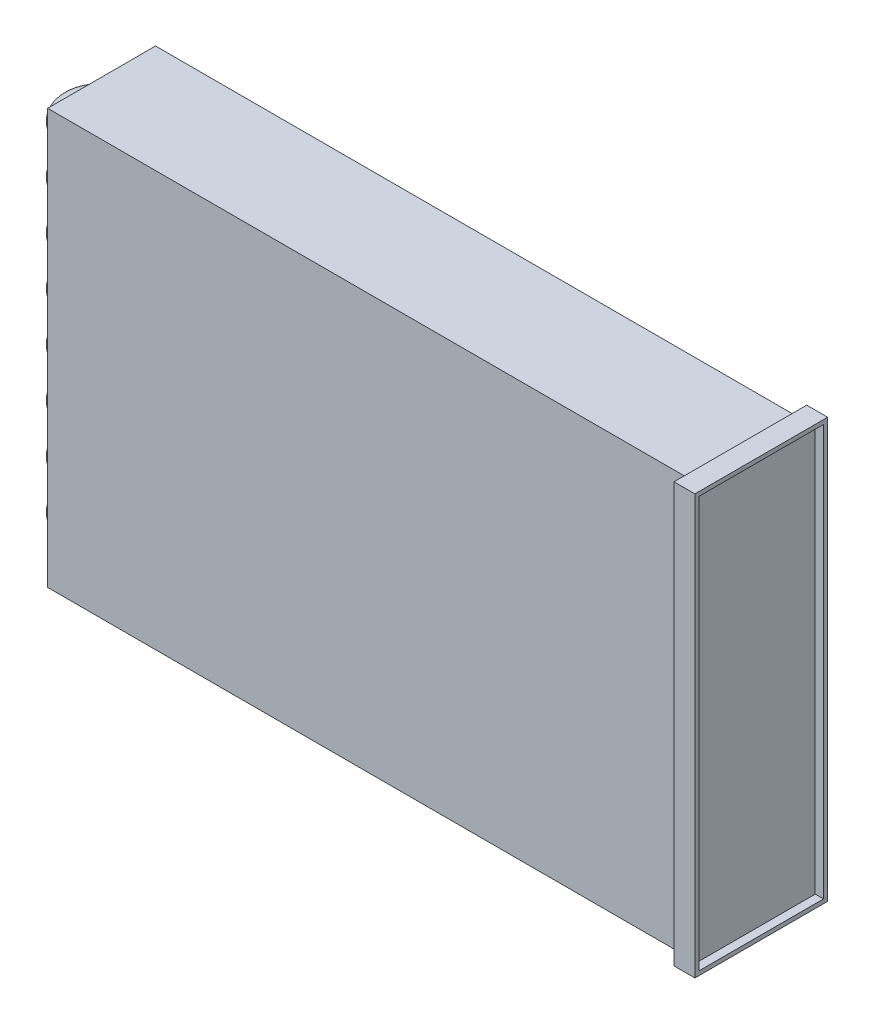
ISO-10303-21;
HEADER;
FILE_DESCRIPTION(('STEP AP214'),'2;1');
FILE_NAME('part.step','',(''),(''),'','','');
FILE_SCHEMA(('AUTOMOTIVE_DESIGN { 1 0 10303 214 1 1 1 1 }'));
ENDSEC;
DATA;
#1=APPLICATION_CONTEXT('core data for automotive mechanical design processes');
#2=APPLICATION_PROTOCOL_DEFINITION('international standard','automotive_design',2000,#1);
#3=PRODUCT_CONTEXT('',#1,'mechanical');
#4=PRODUCT('Part','Part','',(#3));
#5=PRODUCT_RELATED_PRODUCT_CATEGORY('part','',(#4));
#6=PRODUCT_DEFINITION_FORMATION('','',#4);
#7=PRODUCT_DEFINITION_CONTEXT('part definition',#1,'design');
#8=PRODUCT_DEFINITION('design','',#6,#7);
#9=PRODUCT_DEFINITION_SHAPE('','',#8);
#10=(LENGTH_UNIT() NAMED_UNIT(*) SI_UNIT(.MILLI.,.METRE.));
#11=(NAMED_UNIT(*) PLANE_ANGLE_UNIT() SI_UNIT($,.RADIAN.));
#12=(NAMED_UNIT(*) SI_UNIT($,.STERADIAN.) SOLID_ANGLE_UNIT());
#13=UNCERTAINTY_MEASURE_WITH_UNIT(LENGTH_MEASURE(1.E-05),#10,'distance_accuracy_value','');
#14=(GEOMETRIC_REPRESENTATION_CONTEXT(3) GLOBAL_UNCERTAINTY_ASSIGNED_CONTEXT((#13)) GLOBAL_UNIT_ASSIGNED_CONTEXT((#10,
#11,#12)) REPRESENTATION_CONTEXT('',''));
#15=CARTESIAN_POINT('',(0.,0.,0.));
#16=DIRECTION('',(0.,0.,1.));
#17=DIRECTION('',(1.,0.,0.));
#18=AXIS2_PLACEMENT_3D('',#15,#16,#17);
#19=CARTESIAN_POINT('',(-122.1875,-79.375,20.6375));
#20=DIRECTION('',(1.,0.,0.));
#21=DIRECTION('',(0.,0.,-1.));
#22=AXIS2_PLACEMENT_3D('',#19,#20,#21);
#23=PLANE('',#22);
#24=CARTESIAN_POINT('',(-122.1875,-64.575,-10.3125));
#25=DIRECTION('',(-1.,0.,0.));
#26=DIRECTION('',(0.,0.,1.));
#27=AXIS2_PLACEMENT_3D('',#24,#25,#26);
#28=CIRCLE('',#27,4.04999999999999);
#29=CARTESIAN_POINT('',(-122.1875,-64.575,-14.3625));
#30=VERTEX_POINT('',#29);
#31=EDGE_CURVE('E262',#30,#30,#28,.T.);
#32=ORIENTED_EDGE('',*,*,#31,.F.);
#33=EDGE_LOOP('',(#32));
#34=FACE_BOUND('',#33,.T.);
#35=CARTESIAN_POINT('',(-122.1875,-64.575,11.0375));
#36=DIRECTION('',(1.,0.,0.));
#37=DIRECTION('',(0.,0.,-1.));
#38=AXIS2_PLACEMENT_3D('',#35,#36,#37);
#39=CIRCLE('',#38,4.04999999999999);
#40=CARTESIAN_POINT('',(-122.1875,-64.575,15.0875));
#41=VERTEX_POINT('',#40);
#42=EDGE_CURVE('E266',#41,#41,#39,.T.);
#43=ORIENTED_EDGE('',*,*,#42,.T.);
#44=EDGE_LOOP('',(#43));
#45=FACE_BOUND('',#44,.T.);
#46=CARTESIAN_POINT('',(-122.1875,-46.075,-10.3125));
#47=DIRECTION('',(-1.,0.,0.));
#48=DIRECTION('',(0.,0.,1.));
#49=AXIS2_PLACEMENT_3D('',#46,#47,#48);
#50=CIRCLE('',#49,4.04999999999999);
#51=CARTESIAN_POINT('',(-122.1875,-46.075,-14.3625));
#52=VERTEX_POINT('',#51);
#53=EDGE_CURVE('E270',#52,#52,#50,.T.);
#54=ORIENTED_EDGE('',*,*,#53,.F.);
#55=EDGE_LOOP('',(#54));
#56=FACE_BOUND('',#55,.T.);
#57=CARTESIAN_POINT('',(-122.1875,-46.075,11.0375));
#58=DIRECTION('',(1.,0.,0.));
#59=DIRECTION('',(0.,0.,-1.));
#60=AXIS2_PLACEMENT_3D('',#57,#58,#59);
#61=CIRCLE('',#60,4.04999999999999);
#62=CARTESIAN_POINT('',(-122.1875,-46.075,15.0875));
#63=VERTEX_POINT('',#62);
#64=EDGE_CURVE('E274',#63,#63,#61,.T.);
#65=ORIENTED_EDGE('',*,*,#64,.T.);
#66=EDGE_LOOP('',(#65));
#67=FACE_BOUND('',#66,.T.);
#68=CARTESIAN_POINT('',(-122.1875,-27.575,-10.3125));
#69=DIRECTION('',(-1.,0.,0.));
#70=DIRECTION('',(0.,0.,1.));
#71=AXIS2_PLACEMENT_3D('',#68,#69,#70);
#72=CIRCLE('',#71,4.04999999999999);
#73=CARTESIAN_POINT('',(-122.1875,-27.575,-14.3625));
#74=VERTEX_POINT('',#73);
#75=EDGE_CURVE('E278',#74,#74,#72,.T.);
#76=ORIENTED_EDGE('',*,*,#75,.F.);
#77=EDGE_LOOP('',(#76));
#78=FACE_BOUND('',#77,.T.);
#79=CARTESIAN_POINT('',(-122.1875,-27.575,11.0375));
#80=DIRECTION('',(1.,0.,0.));
#81=DIRECTION('',(0.,0.,-1.));
#82=AXIS2_PLACEMENT_3D('',#79,#80,#81);
#83=CIRCLE('',#82,4.04999999999999);
#84=CARTESIAN_POINT('',(-122.1875,-27.575,15.0875));
#85=VERTEX_POINT('',#84);
#86=EDGE_CURVE('E282',#85,#85,#83,.T.);
#87=ORIENTED_EDGE('',*,*,#86,.T.);
#88=EDGE_LOOP('',(#87));
#89=FACE_BOUND('',#88,.T.);
#90=CARTESIAN_POINT('',(-122.1875,-9.075,-10.3125));
#91=DIRECTION('',(-1.,0.,0.));
#92=DIRECTION('',(0.,0.,1.));
#93=AXIS2_PLACEMENT_3D('',#90,#91,#92);
#94=CIRCLE('',#93,4.04999999999999);
#95=CARTESIAN_POINT('',(-122.1875,-9.075,-14.3625));
#96=VERTEX_POINT('',#95);
#97=EDGE_CURVE('E286',#96,#96,#94,.T.);
#98=ORIENTED_EDGE('',*,*,#97,.F.);
#99=EDGE_LOOP('',(#98));
#100=FACE_BOUND('',#99,.T.);
#101=CARTESIAN_POINT('',(-122.1875,-9.075,11.0375));
#102=DIRECTION('',(1.,0.,0.));
#103=DIRECTION('',(0.,0.,-1.));
#104=AXIS2_PLACEMENT_3D('',#101,#102,#103);
#105=CIRCLE('',#104,4.04999999999999);
#106=CARTESIAN_POINT('',(-122.1875,-9.075,15.0875));
#107=VERTEX_POINT('',#106);
#108=EDGE_CURVE('E290',#107,#107,#105,.T.);
#109=ORIENTED_EDGE('',*,*,#108,.T.);
#110=EDGE_LOOP('',(#109));
#111=FACE_BOUND('',#110,.T.);
#112=CARTESIAN_POINT('',(-122.1875,9.425,-10.3125));
#113=DIRECTION('',(-1.,0.,0.));
#114=DIRECTION('',(0.,0.,1.));
#115=AXIS2_PLACEMENT_3D('',#112,#113,#114);
#116=CIRCLE('',#115,4.04999999999999);
#117=CARTESIAN_POINT('',(-122.1875,9.425,-14.3625));
#118=VERTEX_POINT('',#117);
#119=EDGE_CURVE('E294',#118,#118,#116,.T.);
#120=ORIENTED_EDGE('',*,*,#119,.F.);
#121=EDGE_LOOP('',(#120));
#122=FACE_BOUND('',#121,.T.);
#123=CARTESIAN_POINT('',(-122.1875,9.425,11.0375));
#124=DIRECTION('',(1.,0.,0.));
#125=DIRECTION('',(0.,0.,-1.));
#126=AXIS2_PLACEMENT_3D('',#123,#124,#125);
#127=CIRCLE('',#126,4.04999999999999);
#128=CARTESIAN_POINT('',(-122.1875,9.425,15.0875));
#129=VERTEX_POINT('',#128);
#130=EDGE_CURVE('E298',#129,#129,#127,.T.);
#131=ORIENTED_EDGE('',*,*,#130,.T.);
#132=EDGE_LOOP('',(#131));
#133=FACE_BOUND('',#132,.T.);
#134=CARTESIAN_POINT('',(-122.1875,27.925,-10.3125));
#135=DIRECTION('',(-1.,0.,0.));
#136=DIRECTION('',(0.,0.,1.));
#137=AXIS2_PLACEMENT_3D('',#134,#135,#136);
#138=CIRCLE('',#137,4.04999999999999);
#139=CARTESIAN_POINT('',(-122.1875,27.925,-14.3625));
#140=VERTEX_POINT('',#139);
#141=EDGE_CURVE('E302',#140,#140,#138,.T.);
#142=ORIENTED_EDGE('',*,*,#141,.F.);
#143=EDGE_LOOP('',(#142));
#144=FACE_BOUND('',#143,.T.);
#145=CARTESIAN_POINT('',(-122.1875,27.925,11.0375));
#146=DIRECTION('',(1.,0.,0.));
#147=DIRECTION('',(0.,0.,-1.));
#148=AXIS2_PLACEMENT_3D('',#145,#146,#147);
#149=CIRCLE('',#148,4.04999999999999);
#150=CARTESIAN_POINT('',(-122.1875,27.925,15.0875));
#151=VERTEX_POINT('',#150);
#152=EDGE_CURVE('E306',#151,#151,#149,.T.);
#153=ORIENTED_EDGE('',*,*,#152,.T.);
#154=EDGE_LOOP('',(#153));
#155=FACE_BOUND('',#154,.T.);
#156=CARTESIAN_POINT('',(-122.1875,46.425,-10.3125));
#157=DIRECTION('',(-1.,0.,0.));
#158=DIRECTION('',(0.,0.,1.));
#159=AXIS2_PLACEMENT_3D('',#156,#157,#158);
#160=CIRCLE('',#159,4.04999999999999);
#161=CARTESIAN_POINT('',(-122.1875,46.425,-14.3625));
#162=VERTEX_POINT('',#161);
#163=EDGE_CURVE('E310',#162,#162,#160,.T.);
#164=ORIENTED_EDGE('',*,*,#163,.F.);
#165=EDGE_LOOP('',(#164));
#166=FACE_BOUND('',#165,.T.);
#167=CARTESIAN_POINT('',(-122.1875,46.425,11.0375));
#168=DIRECTION('',(1.,0.,0.));
#169=DIRECTION('',(0.,0.,-1.));
#170=AXIS2_PLACEMENT_3D('',#167,#168,#169);
#171=CIRCLE('',#170,4.04999999999999);
#172=CARTESIAN_POINT('',(-122.1875,46.425,15.0875));
#173=VERTEX_POINT('',#172);
#174=EDGE_CURVE('E162',#173,#173,#171,.T.);
#175=ORIENTED_EDGE('',*,*,#174,.T.);
#176=EDGE_LOOP('',(#175));
#177=FACE_BOUND('',#176,.T.);
#178=CARTESIAN_POINT('',(-122.1875,64.925,-10.3125));
#179=DIRECTION('',(-1.,0.,0.));
#180=DIRECTION('',(0.,0.,1.));
#181=AXIS2_PLACEMENT_3D('',#178,#179,#180);
#182=CIRCLE('',#181,4.04999999999999);
#183=CARTESIAN_POINT('',(-122.1875,64.925,-14.3625));
#184=VERTEX_POINT('',#183);
#185=EDGE_CURVE('E174',#184,#184,#182,.T.);
#186=ORIENTED_EDGE('',*,*,#185,.F.);
#187=EDGE_LOOP('',(#186));
#188=FACE_BOUND('',#187,.T.);
#189=CARTESIAN_POINT('',(-122.1875,64.925,11.0375));
#190=DIRECTION('',(1.,0.,0.));
#191=DIRECTION('',(0.,0.,-1.));
#192=AXIS2_PLACEMENT_3D('',#189,#190,#191);
#193=CIRCLE('',#192,4.04999999999999);
#194=CARTESIAN_POINT('',(-122.1875,64.925,15.0875));
#195=VERTEX_POINT('',#194);
#196=EDGE_CURVE('E180',#195,#195,#193,.T.);
#197=ORIENTED_EDGE('',*,*,#196,.T.);
#198=EDGE_LOOP('',(#197));
#199=FACE_BOUND('',#198,.T.);
#200=DIRECTION('',(0.,-1.,0.));
#201=VECTOR('',#200,1.);
#202=CARTESIAN_POINT('',(-122.1875,-79.375,-20.6375));
#203=LINE('',#202,#201);
#204=CARTESIAN_POINT('',(-122.1875,79.375,-20.6375));
#205=VERTEX_POINT('',#204);
#206=CARTESIAN_POINT('',(-122.1875,-79.375,-20.6375));
#207=VERTEX_POINT('',#206);
#208=EDGE_CURVE('E213',#205,#207,#203,.T.);
#209=ORIENTED_EDGE('',*,*,#208,.T.);
#210=DIRECTION('',(0.,0.,-1.));
#211=VECTOR('',#210,1.);
#212=CARTESIAN_POINT('',(-122.1875,-79.375,20.6375));
#213=LINE('',#212,#211);
#214=CARTESIAN_POINT('',(-122.1875,-79.375,20.6375));
#215=VERTEX_POINT('',#214);
#216=EDGE_CURVE('E11',#215,#207,#213,.T.);
#217=ORIENTED_EDGE('',*,*,#216,.F.);
#218=DIRECTION('',(0.,-1.,0.));
#219=VECTOR('',#218,1.);
#220=CARTESIAN_POINT('',(-122.1875,-79.375,20.6375));
#221=LINE('',#220,#219);
#222=CARTESIAN_POINT('',(-122.1875,79.375,20.6375));
#223=VERTEX_POINT('',#222);
#224=EDGE_CURVE('E214',#223,#215,#221,.T.);
#225=ORIENTED_EDGE('',*,*,#224,.F.);
#226=DIRECTION('',(0.,0.,-1.));
#227=VECTOR('',#226,1.);
#228=CARTESIAN_POINT('',(-122.1875,79.375,20.6375));
#229=LINE('',#228,#227);
#230=EDGE_CURVE('E220',#223,#205,#229,.T.);
#231=ORIENTED_EDGE('',*,*,#230,.T.);
#232=EDGE_LOOP('',(#209,#217,#225,#231));
#233=FACE_BOUND('',#232,.T.);
#234=ADVANCED_FACE('F40',(#34,#45,#56,#67,#78,#89,#100,#111,#122,#133,#144,#155,#166,#177,#188,
#199,#233),#23,.F.);
#235=CARTESIAN_POINT('',(-122.1875,-79.375,20.6375));
#236=DIRECTION('',(0.,1.,0.));
#237=DIRECTION('',(0.,0.,1.));
#238=AXIS2_PLACEMENT_3D('',#235,#236,#237);
#239=PLANE('',#238);
#240=DIRECTION('',(1.,0.,0.));
#241=VECTOR('',#240,1.);
#242=CARTESIAN_POINT('',(-122.1875,-79.375,-20.6375));
#243=LINE('',#242,#241);
#244=CARTESIAN_POINT('',(122.1875,-79.375,-20.6375));
#245=VERTEX_POINT('',#244);
#246=EDGE_CURVE('E223',#207,#245,#243,.T.);
#247=ORIENTED_EDGE('',*,*,#246,.T.);
#248=DIRECTION('',(0.,0.,-1.));
#249=VECTOR('',#248,1.);
#250=CARTESIAN_POINT('',(122.1875,-79.375,20.6375));
#251=LINE('',#250,#249);
#252=CARTESIAN_POINT('',(122.1875,-79.375,20.6375));
#253=VERTEX_POINT('',#252);
#254=EDGE_CURVE('E47',#253,#245,#251,.T.);
#255=ORIENTED_EDGE('',*,*,#254,.F.);
#256=DIRECTION('',(1.,0.,0.));
#257=VECTOR('',#256,1.);
#258=CARTESIAN_POINT('',(-122.1875,-79.375,20.6375));
#259=LINE('',#258,#257);
#260=EDGE_CURVE('E87',#215,#253,#259,.T.);
#261=ORIENTED_EDGE('',*,*,#260,.F.);
#262=ORIENTED_EDGE('',*,*,#216,.T.);
#263=EDGE_LOOP('',(#247,#255,#261,#262));
#264=FACE_BOUND('',#263,.T.);
#265=ADVANCED_FACE('F238',(#264),#239,.F.);
#266=CARTESIAN_POINT('',(-122.1875,79.375,20.6375));
#267=DIRECTION('',(0.,-1.,0.));
#268=DIRECTION('',(0.,0.,-1.));
#269=AXIS2_PLACEMENT_3D('',#266,#267,#268);
#270=PLANE('',#269);
#271=DIRECTION('',(-1.,0.,0.));
#272=VECTOR('',#271,1.);
#273=CARTESIAN_POINT('',(-122.1875,79.375,-20.6375));
#274=LINE('',#273,#272);
#275=CARTESIAN_POINT('',(122.1875,79.375,-20.6375));
#276=VERTEX_POINT('',#275);
#277=EDGE_CURVE('E80',#276,#205,#274,.T.);
#278=ORIENTED_EDGE('',*,*,#277,.T.);
#279=ORIENTED_EDGE('',*,*,#230,.F.);
#280=DIRECTION('',(-1.,0.,0.));
#281=VECTOR('',#280,1.);
#282=CARTESIAN_POINT('',(-122.1875,79.375,20.6375));
#283=LINE('',#282,#281);
#284=CARTESIAN_POINT('',(122.1875,79.375,20.6375));
#285=VERTEX_POINT('',#284);
#286=EDGE_CURVE('E63',#285,#223,#283,.T.);
#287=ORIENTED_EDGE('',*,*,#286,.F.);
#288=DIRECTION('',(0.,0.,-1.));
#289=VECTOR('',#288,1.);
#290=CARTESIAN_POINT('',(122.1875,79.375,20.6375));
#291=LINE('',#290,#289);
#292=EDGE_CURVE('E231',#285,#276,#291,.T.);
#293=ORIENTED_EDGE('',*,*,#292,.T.);
#294=EDGE_LOOP('',(#278,#279,#287,#293));
#295=FACE_BOUND('',#294,.T.);
#296=ADVANCED_FACE('F245',(#295),#270,.F.);
#297=CARTESIAN_POINT('',(0.,0.,20.6375));
#298=DIRECTION('',(0.,0.,-1.));
#299=DIRECTION('',(-1.,0.,0.));
#300=AXIS2_PLACEMENT_3D('',#297,#298,#299);
#301=PLANE('',#300);
#302=ORIENTED_EDGE('',*,*,#224,.T.);
#303=ORIENTED_EDGE('',*,*,#260,.T.);
#304=DIRECTION('',(0.,1.,0.));
#305=VECTOR('',#304,1.);
#306=CARTESIAN_POINT('',(122.1875,-79.375,20.6375));
#307=LINE('',#306,#305);
#308=EDGE_CURVE('E217',#253,#285,#307,.T.);
#309=ORIENTED_EDGE('',*,*,#308,.T.);
#310=ORIENTED_EDGE('',*,*,#286,.T.);
#311=EDGE_LOOP('',(#302,#303,#309,#310));
#312=FACE_BOUND('',#311,.T.);
#313=ADVANCED_FACE('F247',(#312),#301,.F.);
#314=CARTESIAN_POINT('',(0.,0.,-20.6375));
#315=DIRECTION('',(0.,0.,-1.));
#316=DIRECTION('',(-1.,0.,0.));
#317=AXIS2_PLACEMENT_3D('',#314,#315,#316);
#318=PLANE('',#317);
#319=ORIENTED_EDGE('',*,*,#208,.F.);
#320=ORIENTED_EDGE('',*,*,#277,.F.);
#321=DIRECTION('',(0.,1.,0.));
#322=VECTOR('',#321,1.);
#323=CARTESIAN_POINT('',(122.1875,-79.375,-20.6375));
#324=LINE('',#323,#322);
#325=EDGE_CURVE('E226',#245,#276,#324,.T.);
#326=ORIENTED_EDGE('',*,*,#325,.F.);
#327=ORIENTED_EDGE('',*,*,#246,.F.);
#328=EDGE_LOOP('',(#319,#320,#326,#327));
#329=FACE_BOUND('',#328,.T.);
#330=ADVANCED_FACE('F242',(#329),#318,.T.);
#331=CARTESIAN_POINT('',(130.1885,80.2,25.4));
#332=DIRECTION('',(0.,0.,-1.));
#333=DIRECTION('',(0.,1.,0.));
#334=AXIS2_PLACEMENT_3D('',#331,#332,#333);
#335=PLANE('',#334);
#336=DIRECTION('',(0.,-1.,0.));
#337=VECTOR('',#336,1.);
#338=CARTESIAN_POINT('',(122.1875,80.2,25.4));
#339=LINE('',#338,#337);
#340=CARTESIAN_POINT('',(122.1875,80.2,25.4));
#341=VERTEX_POINT('',#340);
#342=CARTESIAN_POINT('',(122.1875,-80.1999999999999,25.4));
#343=VERTEX_POINT('',#342);
#344=EDGE_CURVE('E183',#341,#343,#339,.T.);
#345=ORIENTED_EDGE('',*,*,#344,.T.);
#346=DIRECTION('',(-1.,0.,0.));
#347=VECTOR('',#346,1.);
#348=CARTESIAN_POINT('',(130.1885,-80.1999999999999,25.4));
#349=LINE('',#348,#347);
#350=CARTESIAN_POINT('',(130.1885,-80.1999999999999,25.4));
#351=VERTEX_POINT('',#350);
#352=EDGE_CURVE('E210',#351,#343,#349,.T.);
#353=ORIENTED_EDGE('',*,*,#352,.F.);
#354=DIRECTION('',(0.,-1.,0.));
#355=VECTOR('',#354,1.);
#356=CARTESIAN_POINT('',(130.1885,80.2,25.4));
#357=LINE('',#356,#355);
#358=CARTESIAN_POINT('',(130.1885,80.2,25.4));
#359=VERTEX_POINT('',#358);
#360=EDGE_CURVE('E184',#359,#351,#357,.T.);
#361=ORIENTED_EDGE('',*,*,#360,.F.);
#362=DIRECTION('',(-1.,0.,0.));
#363=VECTOR('',#362,1.);
#364=CARTESIAN_POINT('',(130.1885,80.2,25.4));
#365=LINE('',#364,#363);
#366=EDGE_CURVE('E194',#359,#341,#365,.T.);
#367=ORIENTED_EDGE('',*,*,#366,.T.);
#368=EDGE_LOOP('',(#345,#353,#361,#367));
#369=FACE_BOUND('',#368,.T.);
#370=ADVANCED_FACE('F346',(#369),#335,.F.);
#371=CARTESIAN_POINT('',(130.1885,-80.2,-25.4));
#372=DIRECTION('',(0.,1.,0.));
#373=DIRECTION('',(0.,0.,1.));
#374=AXIS2_PLACEMENT_3D('',#371,#372,#373);
#375=PLANE('',#374);
#376=DIRECTION('',(0.,0.,-1.));
#377=VECTOR('',#376,1.);
#378=CARTESIAN_POINT('',(122.1875,-80.2,-25.4));
#379=LINE('',#378,#377);
#380=CARTESIAN_POINT('',(122.1875,-80.2,-25.4));
#381=VERTEX_POINT('',#380);
#382=EDGE_CURVE('E197',#343,#381,#379,.T.);
#383=ORIENTED_EDGE('',*,*,#382,.T.);
#384=DIRECTION('',(-1.,0.,0.));
#385=VECTOR('',#384,1.);
#386=CARTESIAN_POINT('',(130.1885,-80.2,-25.4));
#387=LINE('',#386,#385);
#388=CARTESIAN_POINT('',(130.1885,-80.2,-25.4));
#389=VERTEX_POINT('',#388);
#390=EDGE_CURVE('E207',#389,#381,#387,.T.);
#391=ORIENTED_EDGE('',*,*,#390,.F.);
#392=DIRECTION('',(0.,0.,-1.));
#393=VECTOR('',#392,1.);
#394=CARTESIAN_POINT('',(130.1885,-80.2,-25.4));
#395=LINE('',#394,#393);
#396=EDGE_CURVE('E187',#351,#389,#395,.T.);
#397=ORIENTED_EDGE('',*,*,#396,.F.);
#398=ORIENTED_EDGE('',*,*,#352,.T.);
#399=EDGE_LOOP('',(#383,#391,#397,#398));
#400=FACE_BOUND('',#399,.T.);
#401=ADVANCED_FACE('F342',(#400),#375,.F.);
#402=CARTESIAN_POINT('',(130.1885,80.2,-25.4));
#403=DIRECTION('',(0.,0.,1.));
#404=DIRECTION('',(0.,-1.,0.));
#405=AXIS2_PLACEMENT_3D('',#402,#403,#404);
#406=PLANE('',#405);
#407=DIRECTION('',(0.,1.,0.));
#408=VECTOR('',#407,1.);
#409=CARTESIAN_POINT('',(122.1875,80.2,-25.4));
#410=LINE('',#409,#408);
#411=CARTESIAN_POINT('',(122.1875,80.2,-25.4));
#412=VERTEX_POINT('',#411);
#413=EDGE_CURVE('E199',#381,#412,#410,.T.);
#414=ORIENTED_EDGE('',*,*,#413,.T.);
#415=DIRECTION('',(-1.,0.,0.));
#416=VECTOR('',#415,1.);
#417=CARTESIAN_POINT('',(130.1885,80.2,-25.4));
#418=LINE('',#417,#416);
#419=CARTESIAN_POINT('',(130.1885,80.2,-25.4));
#420=VERTEX_POINT('',#419);
#421=EDGE_CURVE('E204',#420,#412,#418,.T.);
#422=ORIENTED_EDGE('',*,*,#421,.F.);
#423=DIRECTION('',(0.,1.,0.));
#424=VECTOR('',#423,1.);
#425=CARTESIAN_POINT('',(130.1885,80.2,-25.4));
#426=LINE('',#425,#424);
#427=EDGE_CURVE('E190',#389,#420,#426,.T.);
#428=ORIENTED_EDGE('',*,*,#427,.F.);
#429=ORIENTED_EDGE('',*,*,#390,.T.);
#430=EDGE_LOOP('',(#414,#422,#428,#429));
#431=FACE_BOUND('',#430,.T.);
#432=ADVANCED_FACE('F338',(#431),#406,.F.);
#433=CARTESIAN_POINT('',(130.1885,80.2,-25.4));
#434=DIRECTION('',(0.,-1.,0.));
#435=DIRECTION('',(0.,0.,-1.));
#436=AXIS2_PLACEMENT_3D('',#433,#434,#435);
#437=PLANE('',#436);
#438=DIRECTION('',(0.,0.,1.));
#439=VECTOR('',#438,1.);
#440=CARTESIAN_POINT('',(122.1875,80.2,-25.4));
#441=LINE('',#440,#439);
#442=EDGE_CURVE('E188',#412,#341,#441,.T.);
#443=ORIENTED_EDGE('',*,*,#442,.T.);
#444=ORIENTED_EDGE('',*,*,#366,.F.);
#445=DIRECTION('',(0.,0.,1.));
#446=VECTOR('',#445,1.);
#447=CARTESIAN_POINT('',(130.1885,80.2,-25.4));
#448=LINE('',#447,#446);
#449=EDGE_CURVE('E192',#420,#359,#448,.T.);
#450=ORIENTED_EDGE('',*,*,#449,.F.);
#451=ORIENTED_EDGE('',*,*,#421,.T.);
#452=EDGE_LOOP('',(#443,#444,#450,#451));
#453=FACE_BOUND('',#452,.T.);
#454=ADVANCED_FACE('F333',(#453),#437,.F.);
#455=CARTESIAN_POINT('',(130.1885,0.,0.));
#456=DIRECTION('',(-1.,0.,0.));
#457=DIRECTION('',(0.,0.,1.));
#458=AXIS2_PLACEMENT_3D('',#455,#456,#457);
#459=PLANE('',#458);
#460=DIRECTION('',(0.,0.,1.));
#461=VECTOR('',#460,1.);
#462=CARTESIAN_POINT('',(130.1885,78.6125,23.8125));
#463=LINE('',#462,#461);
#464=CARTESIAN_POINT('',(130.1885,78.6125000000001,-23.8125));
#465=VERTEX_POINT('',#464);
#466=CARTESIAN_POINT('',(130.1885,78.6125,23.8125));
#467=VERTEX_POINT('',#466);
#468=EDGE_CURVE('E168',#465,#467,#463,.T.);
#469=ORIENTED_EDGE('',*,*,#468,.F.);
#470=DIRECTION('',(0.,1.,0.));
#471=VECTOR('',#470,1.);
#472=CARTESIAN_POINT('',(130.1885,-78.6124999999999,-23.8125));
#473=LINE('',#472,#471);
#474=CARTESIAN_POINT('',(130.1885,-78.6124999999999,-23.8125));
#475=VERTEX_POINT('',#474);
#476=EDGE_CURVE('E54',#475,#465,#473,.T.);
#477=ORIENTED_EDGE('',*,*,#476,.F.);
#478=DIRECTION('',(0.,0.,-1.));
#479=VECTOR('',#478,1.);
#480=CARTESIAN_POINT('',(130.1885,-78.6124999999999,23.8125));
#481=LINE('',#480,#479);
#482=CARTESIAN_POINT('',(130.1885,-78.6124999999999,23.8125));
#483=VERTEX_POINT('',#482);
#484=EDGE_CURVE('E156',#483,#475,#481,.T.);
#485=ORIENTED_EDGE('',*,*,#484,.F.);
#486=DIRECTION('',(0.,-1.,0.));
#487=VECTOR('',#486,1.);
#488=CARTESIAN_POINT('',(130.1885,-78.6124999999999,23.8125));
#489=LINE('',#488,#487);
#490=EDGE_CURVE('E159',#467,#483,#489,.T.);
#491=ORIENTED_EDGE('',*,*,#490,.F.);
#492=EDGE_LOOP('',(#469,#477,#485,#491));
#493=FACE_BOUND('',#492,.T.);
#494=ORIENTED_EDGE('',*,*,#360,.T.);
#495=ORIENTED_EDGE('',*,*,#396,.T.);
#496=ORIENTED_EDGE('',*,*,#427,.T.);
#497=ORIENTED_EDGE('',*,*,#449,.T.);
#498=EDGE_LOOP('',(#494,#495,#496,#497));
#499=FACE_BOUND('',#498,.T.);
#500=ADVANCED_FACE('F328',(#493,#499),#459,.F.);
#501=CARTESIAN_POINT('',(122.1875,0.,0.));
#502=DIRECTION('',(-1.,0.,0.));
#503=DIRECTION('',(0.,0.,1.));
#504=AXIS2_PLACEMENT_3D('',#501,#502,#503);
#505=PLANE('',#504);
#506=ORIENTED_EDGE('',*,*,#254,.T.);
#507=ORIENTED_EDGE('',*,*,#325,.T.);
#508=ORIENTED_EDGE('',*,*,#292,.F.);
#509=ORIENTED_EDGE('',*,*,#308,.F.);
#510=EDGE_LOOP('',(#506,#507,#508,#509));
#511=FACE_BOUND('',#510,.T.);
#512=ORIENTED_EDGE('',*,*,#344,.F.);
#513=ORIENTED_EDGE('',*,*,#442,.F.);
#514=ORIENTED_EDGE('',*,*,#413,.F.);
#515=ORIENTED_EDGE('',*,*,#382,.F.);
#516=EDGE_LOOP('',(#512,#513,#514,#515));
#517=FACE_BOUND('',#516,.T.);
#518=ADVANCED_FACE('F235',(#511,#517),#505,.T.);
#519=CARTESIAN_POINT('',(-122.1875,64.925,0.362500000000002));
#520=DIRECTION('',(0.,1.,0.));
#521=DIRECTION('',(0.,0.,1.));
#522=AXIS2_PLACEMENT_3D('',#519,#520,#521);
#523=TOROIDAL_SURFACE('',#522,10.675,4.04999999999999);
#524=CARTESIAN_POINT('',(-122.1875,64.925,0.362500000000002));
#525=DIRECTION('',(0.,1.,0.));
#526=DIRECTION('',(0.,0.,1.));
#527=AXIS2_PLACEMENT_3D('',#524,#525,#526);
#528=CIRCLE('',#527,14.725);
#529=EDGE_CURVE('',#184,#195,#528,.T.);
#530=ORIENTED_EDGE('',*,*,#185,.T.);
#531=ORIENTED_EDGE('',*,*,#196,.F.);
#532=ORIENTED_EDGE('',*,*,#529,.T.);
#533=ORIENTED_EDGE('',*,*,#529,.F.);
#534=EDGE_LOOP('',(#530,#532,#531,#533));
#535=FACE_BOUND('',#534,.T.);
#536=ADVANCED_FACE('F318',(#535),#523,.T.);
#537=CARTESIAN_POINT('',(127.0135,-78.6124999999999,-23.8125));
#538=DIRECTION('',(0.,0.,-1.));
#539=DIRECTION('',(-1.,0.,0.));
#540=AXIS2_PLACEMENT_3D('',#537,#538,#539);
#541=PLANE('',#540);
#542=ORIENTED_EDGE('',*,*,#476,.T.);
#543=DIRECTION('',(1.,0.,0.));
#544=VECTOR('',#543,1.);
#545=CARTESIAN_POINT('',(127.0135,78.6125000000001,-23.8125));
#546=LINE('',#545,#544);
#547=CARTESIAN_POINT('',(127.0135,78.6125000000001,-23.8125));
#548=VERTEX_POINT('',#547);
#549=EDGE_CURVE('E134',#548,#465,#546,.T.);
#550=ORIENTED_EDGE('',*,*,#549,.F.);
#551=DIRECTION('',(0.,1.,0.));
#552=VECTOR('',#551,1.);
#553=CARTESIAN_POINT('',(127.0135,-78.6124999999999,-23.8125));
#554=LINE('',#553,#552);
#555=CARTESIAN_POINT('',(127.0135,-78.6124999999999,-23.8125));
#556=VERTEX_POINT('',#555);
#557=EDGE_CURVE('E138',#556,#548,#554,.T.);
#558=ORIENTED_EDGE('',*,*,#557,.F.);
#559=DIRECTION('',(1.,0.,0.));
#560=VECTOR('',#559,1.);
#561=CARTESIAN_POINT('',(127.0135,-78.6124999999999,-23.8125));
#562=LINE('',#561,#560);
#563=EDGE_CURVE('E172',#556,#475,#562,.T.);
#564=ORIENTED_EDGE('',*,*,#563,.T.);
#565=EDGE_LOOP('',(#542,#550,#558,#564));
#566=FACE_BOUND('',#565,.T.);
#567=ADVANCED_FACE('F136',(#566),#541,.F.);
#568=CARTESIAN_POINT('',(127.0135,-78.6124999999999,23.8125));
#569=DIRECTION('',(0.,-1.,0.));
#570=DIRECTION('',(0.,0.,-1.));
#571=AXIS2_PLACEMENT_3D('',#568,#569,#570);
#572=PLANE('',#571);
#573=ORIENTED_EDGE('',*,*,#484,.T.);
#574=ORIENTED_EDGE('',*,*,#563,.F.);
#575=DIRECTION('',(0.,0.,-1.));
#576=VECTOR('',#575,1.);
#577=CARTESIAN_POINT('',(127.0135,-78.6124999999999,23.8125));
#578=LINE('',#577,#576);
#579=CARTESIAN_POINT('',(127.0135,-78.6124999999999,23.8125));
#580=VERTEX_POINT('',#579);
#581=EDGE_CURVE('E144',#580,#556,#578,.T.);
#582=ORIENTED_EDGE('',*,*,#581,.F.);
#583=DIRECTION('',(1.,0.,0.));
#584=VECTOR('',#583,1.);
#585=CARTESIAN_POINT('',(127.0135,-78.6124999999999,23.8125));
#586=LINE('',#585,#584);
#587=EDGE_CURVE('E175',#580,#483,#586,.T.);
#588=ORIENTED_EDGE('',*,*,#587,.T.);
#589=EDGE_LOOP('',(#573,#574,#582,#588));
#590=FACE_BOUND('',#589,.T.);
#591=ADVANCED_FACE('F326',(#590),#572,.F.);
#592=CARTESIAN_POINT('',(127.0135,-78.6124999999999,23.8125));
#593=DIRECTION('',(0.,0.,1.));
#594=DIRECTION('',(1.,0.,0.));
#595=AXIS2_PLACEMENT_3D('',#592,#593,#594);
#596=PLANE('',#595);
#597=ORIENTED_EDGE('',*,*,#490,.T.);
#598=ORIENTED_EDGE('',*,*,#587,.F.);
#599=DIRECTION('',(0.,-1.,0.));
#600=VECTOR('',#599,1.);
#601=CARTESIAN_POINT('',(127.0135,-78.6124999999999,23.8125));
#602=LINE('',#601,#600);
#603=CARTESIAN_POINT('',(127.0135,78.6125,23.8125));
#604=VERTEX_POINT('',#603);
#605=EDGE_CURVE('E152',#604,#580,#602,.T.);
#606=ORIENTED_EDGE('',*,*,#605,.F.);
#607=DIRECTION('',(1.,0.,0.));
#608=VECTOR('',#607,1.);
#609=CARTESIAN_POINT('',(127.0135,78.6125,23.8125));
#610=LINE('',#609,#608);
#611=EDGE_CURVE('E143',#604,#467,#610,.T.);
#612=ORIENTED_EDGE('',*,*,#611,.T.);
#613=EDGE_LOOP('',(#597,#598,#606,#612));
#614=FACE_BOUND('',#613,.T.);
#615=ADVANCED_FACE('F398',(#614),#596,.F.);
#616=CARTESIAN_POINT('',(127.0135,78.6125,23.8125));
#617=DIRECTION('',(0.,1.,0.));
#618=DIRECTION('',(0.,0.,1.));
#619=AXIS2_PLACEMENT_3D('',#616,#617,#618);
#620=PLANE('',#619);
#621=ORIENTED_EDGE('',*,*,#468,.T.);
#622=ORIENTED_EDGE('',*,*,#611,.F.);
#623=DIRECTION('',(0.,0.,1.));
#624=VECTOR('',#623,1.);
#625=CARTESIAN_POINT('',(127.0135,78.6125,23.8125));
#626=LINE('',#625,#624);
#627=EDGE_CURVE('E147',#548,#604,#626,.T.);
#628=ORIENTED_EDGE('',*,*,#627,.F.);
#629=ORIENTED_EDGE('',*,*,#549,.T.);
#630=EDGE_LOOP('',(#621,#622,#628,#629));
#631=FACE_BOUND('',#630,.T.);
#632=ADVANCED_FACE('F148',(#631),#620,.F.);
#633=CARTESIAN_POINT('',(127.0135,0.,0.));
#634=DIRECTION('',(-1.,0.,0.));
#635=DIRECTION('',(0.,0.,1.));
#636=AXIS2_PLACEMENT_3D('',#633,#634,#635);
#637=PLANE('',#636);
#638=ORIENTED_EDGE('',*,*,#557,.T.);
#639=ORIENTED_EDGE('',*,*,#627,.T.);
#640=ORIENTED_EDGE('',*,*,#605,.T.);
#641=ORIENTED_EDGE('',*,*,#581,.T.);
#642=EDGE_LOOP('',(#638,#639,#640,#641));
#643=FACE_BOUND('',#642,.T.);
#644=ADVANCED_FACE('F154',(#643),#637,.F.);
#645=CARTESIAN_POINT('',(-122.1875,46.425,0.362500000000002));
#646=DIRECTION('',(0.,1.,0.));
#647=DIRECTION('',(0.,0.,1.));
#648=AXIS2_PLACEMENT_3D('',#645,#646,#647);
#649=TOROIDAL_SURFACE('',#648,10.675,4.04999999999999);
#650=CARTESIAN_POINT('',(-122.1875,46.425,0.362500000000002));
#651=DIRECTION('',(0.,1.,0.));
#652=DIRECTION('',(0.,0.,1.));
#653=AXIS2_PLACEMENT_3D('',#650,#651,#652);
#654=CIRCLE('',#653,14.725);
#655=EDGE_CURVE('',#162,#173,#654,.T.);
#656=ORIENTED_EDGE('',*,*,#163,.T.);
#657=ORIENTED_EDGE('',*,*,#174,.F.);
#658=ORIENTED_EDGE('',*,*,#655,.T.);
#659=ORIENTED_EDGE('',*,*,#655,.F.);
#660=EDGE_LOOP('',(#656,#658,#657,#659));
#661=FACE_BOUND('',#660,.T.);
#662=ADVANCED_FACE('F421',(#661),#649,.T.);
#663=CARTESIAN_POINT('',(-122.1875,27.925,0.362500000000002));
#664=DIRECTION('',(0.,1.,0.));
#665=DIRECTION('',(0.,0.,1.));
#666=AXIS2_PLACEMENT_3D('',#663,#664,#665);
#667=TOROIDAL_SURFACE('',#666,10.675,4.04999999999999);
#668=CARTESIAN_POINT('',(-122.1875,27.925,0.362500000000002));
#669=DIRECTION('',(0.,1.,0.));
#670=DIRECTION('',(0.,0.,1.));
#671=AXIS2_PLACEMENT_3D('',#668,#669,#670);
#672=CIRCLE('',#671,14.725);
#673=EDGE_CURVE('',#140,#151,#672,.T.);
#674=ORIENTED_EDGE('',*,*,#141,.T.);
#675=ORIENTED_EDGE('',*,*,#152,.F.);
#676=ORIENTED_EDGE('',*,*,#673,.T.);
#677=ORIENTED_EDGE('',*,*,#673,.F.);
#678=EDGE_LOOP('',(#674,#676,#675,#677));
#679=FACE_BOUND('',#678,.T.);
#680=ADVANCED_FACE('F430',(#679),#667,.T.);
#681=CARTESIAN_POINT('',(-122.1875,9.425,0.362500000000002));
#682=DIRECTION('',(0.,1.,0.));
#683=DIRECTION('',(0.,0.,1.));
#684=AXIS2_PLACEMENT_3D('',#681,#682,#683);
#685=TOROIDAL_SURFACE('',#684,10.675,4.04999999999999);
#686=CARTESIAN_POINT('',(-122.1875,9.425,0.362500000000002));
#687=DIRECTION('',(0.,1.,0.));
#688=DIRECTION('',(0.,0.,1.));
#689=AXIS2_PLACEMENT_3D('',#686,#687,#688);
#690=CIRCLE('',#689,14.725);
#691=EDGE_CURVE('',#118,#129,#690,.T.);
#692=ORIENTED_EDGE('',*,*,#119,.T.);
#693=ORIENTED_EDGE('',*,*,#130,.F.);
#694=ORIENTED_EDGE('',*,*,#691,.T.);
#695=ORIENTED_EDGE('',*,*,#691,.F.);
#696=EDGE_LOOP('',(#692,#694,#693,#695));
#697=FACE_BOUND('',#696,.T.);
#698=ADVANCED_FACE('F439',(#697),#685,.T.);
#699=CARTESIAN_POINT('',(-122.1875,-9.075,0.362500000000002));
#700=DIRECTION('',(0.,1.,0.));
#701=DIRECTION('',(0.,0.,1.));
#702=AXIS2_PLACEMENT_3D('',#699,#700,#701);
#703=TOROIDAL_SURFACE('',#702,10.675,4.04999999999999);
#704=CARTESIAN_POINT('',(-122.1875,-9.075,0.362500000000002));
#705=DIRECTION('',(0.,1.,0.));
#706=DIRECTION('',(0.,0.,1.));
#707=AXIS2_PLACEMENT_3D('',#704,#705,#706);
#708=CIRCLE('',#707,14.725);
#709=EDGE_CURVE('',#96,#107,#708,.T.);
#710=ORIENTED_EDGE('',*,*,#97,.T.);
#711=ORIENTED_EDGE('',*,*,#108,.F.);
#712=ORIENTED_EDGE('',*,*,#709,.T.);
#713=ORIENTED_EDGE('',*,*,#709,.F.);
#714=EDGE_LOOP('',(#710,#712,#711,#713));
#715=FACE_BOUND('',#714,.T.);
#716=ADVANCED_FACE('F448',(#715),#703,.T.);
#717=CARTESIAN_POINT('',(-122.1875,-27.575,0.362500000000002));
#718=DIRECTION('',(0.,1.,0.));
#719=DIRECTION('',(0.,0.,1.));
#720=AXIS2_PLACEMENT_3D('',#717,#718,#719);
#721=TOROIDAL_SURFACE('',#720,10.675,4.04999999999999);
#722=CARTESIAN_POINT('',(-122.1875,-27.575,0.362500000000002));
#723=DIRECTION('',(0.,1.,0.));
#724=DIRECTION('',(0.,0.,1.));
#725=AXIS2_PLACEMENT_3D('',#722,#723,#724);
#726=CIRCLE('',#725,14.725);
#727=EDGE_CURVE('',#74,#85,#726,.T.);
#728=ORIENTED_EDGE('',*,*,#75,.T.);
#729=ORIENTED_EDGE('',*,*,#86,.F.);
#730=ORIENTED_EDGE('',*,*,#727,.T.);
#731=ORIENTED_EDGE('',*,*,#727,.F.);
#732=EDGE_LOOP('',(#728,#730,#729,#731));
#733=FACE_BOUND('',#732,.T.);
#734=ADVANCED_FACE('F457',(#733),#721,.T.);
#735=CARTESIAN_POINT('',(-122.1875,-46.075,0.362500000000002));
#736=DIRECTION('',(0.,1.,0.));
#737=DIRECTION('',(0.,0.,1.));
#738=AXIS2_PLACEMENT_3D('',#735,#736,#737);
#739=TOROIDAL_SURFACE('',#738,10.675,4.04999999999999);
#740=CARTESIAN_POINT('',(-122.1875,-46.075,0.362500000000002));
#741=DIRECTION('',(0.,1.,0.));
#742=DIRECTION('',(0.,0.,1.));
#743=AXIS2_PLACEMENT_3D('',#740,#741,#742);
#744=CIRCLE('',#743,14.725);
#745=EDGE_CURVE('',#52,#63,#744,.T.);
#746=ORIENTED_EDGE('',*,*,#53,.T.);
#747=ORIENTED_EDGE('',*,*,#64,.F.);
#748=ORIENTED_EDGE('',*,*,#745,.T.);
#749=ORIENTED_EDGE('',*,*,#745,.F.);
#750=EDGE_LOOP('',(#746,#748,#747,#749));
#751=FACE_BOUND('',#750,.T.);
#752=ADVANCED_FACE('F466',(#751),#739,.T.);
#753=CARTESIAN_POINT('',(-122.1875,-64.575,0.362500000000002));
#754=DIRECTION('',(0.,1.,0.));
#755=DIRECTION('',(0.,0.,1.));
#756=AXIS2_PLACEMENT_3D('',#753,#754,#755);
#757=TOROIDAL_SURFACE('',#756,10.675,4.04999999999999);
#758=CARTESIAN_POINT('',(-122.1875,-64.575,0.362500000000002));
#759=DIRECTION('',(0.,1.,0.));
#760=DIRECTION('',(0.,0.,1.));
#761=AXIS2_PLACEMENT_3D('',#758,#759,#760);
#762=CIRCLE('',#761,14.725);
#763=EDGE_CURVE('',#30,#41,#762,.T.);
#764=ORIENTED_EDGE('',*,*,#31,.T.);
#765=ORIENTED_EDGE('',*,*,#42,.F.);
#766=ORIENTED_EDGE('',*,*,#763,.T.);
#767=ORIENTED_EDGE('',*,*,#763,.F.);
#768=EDGE_LOOP('',(#764,#766,#765,#767));
#769=FACE_BOUND('',#768,.T.);
#770=ADVANCED_FACE('F475',(#769),#757,.T.);
#771=CLOSED_SHELL('',(#234,#265,#296,#313,#330,#370,#401,#432,#454,#500,#518,#536,#567,#591,
#615,#632,#644,#662,#680,#698,#716,#734,#752,#770));
#772=MANIFOLD_SOLID_BREP('B2',#771);
#773=ADVANCED_BREP_SHAPE_REPRESENTATION('',(#18,#772),#14);
#774=SHAPE_DEFINITION_REPRESENTATION(#9,#773);
ENDSEC;
END-ISO-10303-21;
